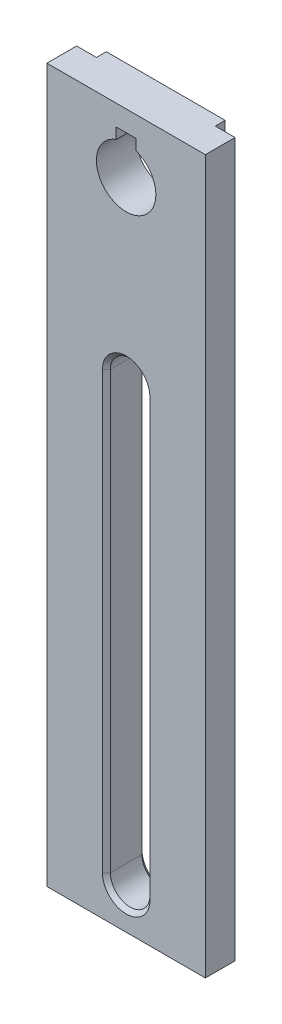
ISO-10303-21;
HEADER;
FILE_DESCRIPTION(('STEP AP214'),'2;1');
FILE_NAME('part.step','',(''),(''),'','','');
FILE_SCHEMA(('AUTOMOTIVE_DESIGN { 1 0 10303 214 1 1 1 1 }'));
ENDSEC;
DATA;
#1=APPLICATION_CONTEXT('core data for automotive mechanical design processes');
#2=APPLICATION_PROTOCOL_DEFINITION('international standard','automotive_design',2000,#1);
#3=PRODUCT_CONTEXT('',#1,'mechanical');
#4=PRODUCT('Part','Part','',(#3));
#5=PRODUCT_RELATED_PRODUCT_CATEGORY('part','',(#4));
#6=PRODUCT_DEFINITION_FORMATION('','',#4);
#7=PRODUCT_DEFINITION_CONTEXT('part definition',#1,'design');
#8=PRODUCT_DEFINITION('design','',#6,#7);
#9=PRODUCT_DEFINITION_SHAPE('','',#8);
#10=(LENGTH_UNIT() NAMED_UNIT(*) SI_UNIT(.MILLI.,.METRE.));
#11=(NAMED_UNIT(*) PLANE_ANGLE_UNIT() SI_UNIT($,.RADIAN.));
#12=(NAMED_UNIT(*) SI_UNIT($,.STERADIAN.) SOLID_ANGLE_UNIT());
#13=UNCERTAINTY_MEASURE_WITH_UNIT(LENGTH_MEASURE(1.E-05),#10,'distance_accuracy_value','');
#14=(GEOMETRIC_REPRESENTATION_CONTEXT(3) GLOBAL_UNCERTAINTY_ASSIGNED_CONTEXT((#13)) GLOBAL_UNIT_ASSIGNED_CONTEXT((#10,
#11,#12)) REPRESENTATION_CONTEXT('',''));
#15=CARTESIAN_POINT('',(0.,0.,0.));
#16=DIRECTION('',(0.,0.,1.));
#17=DIRECTION('',(1.,0.,0.));
#18=AXIS2_PLACEMENT_3D('',#15,#16,#17);
#19=CARTESIAN_POINT('',(0.,0.,10.));
#20=DIRECTION('',(0.,0.,1.));
#21=DIRECTION('',(1.,0.,0.));
#22=AXIS2_PLACEMENT_3D('',#19,#20,#21);
#23=PLANE('',#22);
#24=DIRECTION('',(0.,1.,0.));
#25=VECTOR('',#24,1.);
#26=CARTESIAN_POINT('',(-5.99999999999999,0.,9.99999999999995));
#27=LINE('',#26,#25);
#28=CARTESIAN_POINT('',(-6.00000000000001,30.,9.99999999999995));
#29=VERTEX_POINT('',#28);
#30=CARTESIAN_POINT('',(-5.99999999999999,140.,9.99999999999995));
#31=VERTEX_POINT('',#30);
#32=EDGE_CURVE('E234',#29,#31,#27,.T.);
#33=ORIENTED_EDGE('',*,*,#32,.T.);
#34=CARTESIAN_POINT('',(0.,140.,9.99999999999995));
#35=DIRECTION('',(0.,0.,1.));
#36=DIRECTION('',(1.,0.,0.));
#37=AXIS2_PLACEMENT_3D('',#34,#35,#36);
#38=CIRCLE('',#37,5.99999999999997);
#39=CARTESIAN_POINT('',(5.99999999999994,140.,9.99999999999995));
#40=VERTEX_POINT('',#39);
#41=EDGE_CURVE('E11',#31,#40,#38,.F.);
#42=ORIENTED_EDGE('',*,*,#41,.T.);
#43=DIRECTION('',(0.,-1.,0.));
#44=VECTOR('',#43,1.);
#45=CARTESIAN_POINT('',(6.00000000000001,0.,10.));
#46=LINE('',#45,#44);
#47=CARTESIAN_POINT('',(5.99999999999999,30.,9.99999999999995));
#48=VERTEX_POINT('',#47);
#49=EDGE_CURVE('E46',#40,#48,#46,.T.);
#50=ORIENTED_EDGE('',*,*,#49,.T.);
#51=CARTESIAN_POINT('',(0.,30.,9.99999999999995));
#52=DIRECTION('',(0.,0.,1.));
#53=DIRECTION('',(1.,0.,0.));
#54=AXIS2_PLACEMENT_3D('',#51,#52,#53);
#55=CIRCLE('',#54,6.);
#56=EDGE_CURVE('E236',#48,#29,#55,.F.);
#57=ORIENTED_EDGE('',*,*,#56,.T.);
#58=EDGE_LOOP('',(#33,#42,#50,#57));
#59=FACE_BOUND('',#58,.T.);
#60=DIRECTION('',(1.,0.,0.));
#61=VECTOR('',#60,1.);
#62=CARTESIAN_POINT('',(20.,20.,10.));
#63=LINE('',#62,#61);
#64=CARTESIAN_POINT('',(-19.9999999999999,20.,9.99999999999995));
#65=VERTEX_POINT('',#64);
#66=CARTESIAN_POINT('',(20.,20.,10.));
#67=VERTEX_POINT('',#66);
#68=EDGE_CURVE('E320',#65,#67,#63,.T.);
#69=ORIENTED_EDGE('',*,*,#68,.T.);
#70=DIRECTION('',(0.,1.,0.));
#71=VECTOR('',#70,1.);
#72=CARTESIAN_POINT('',(20.,200.,9.99999999999995));
#73=LINE('',#72,#71);
#74=CARTESIAN_POINT('',(20.,200.,9.99999999999995));
#75=VERTEX_POINT('',#74);
#76=EDGE_CURVE('E199',#67,#75,#73,.T.);
#77=ORIENTED_EDGE('',*,*,#76,.T.);
#78=DIRECTION('',(-1.,0.,0.));
#79=VECTOR('',#78,1.);
#80=CARTESIAN_POINT('',(20.,200.,9.99999999999995));
#81=LINE('',#80,#79);
#82=CARTESIAN_POINT('',(-20.,200.,9.99999999999995));
#83=VERTEX_POINT('',#82);
#84=EDGE_CURVE('E324',#75,#83,#81,.T.);
#85=ORIENTED_EDGE('',*,*,#84,.T.);
#86=DIRECTION('',(0.,-1.,0.));
#87=VECTOR('',#86,1.);
#88=CARTESIAN_POINT('',(-20.,200.,9.99999999999995));
#89=LINE('',#88,#87);
#90=EDGE_CURVE('E326',#83,#65,#89,.T.);
#91=ORIENTED_EDGE('',*,*,#90,.T.);
#92=EDGE_LOOP('',(#69,#77,#85,#91));
#93=FACE_BOUND('',#92,.T.);
#94=CARTESIAN_POINT('',(0.,185.,9.99999999999995));
#95=DIRECTION('',(0.,0.,1.));
#96=DIRECTION('',(1.,0.,0.));
#97=AXIS2_PLACEMENT_3D('',#94,#95,#96);
#98=CIRCLE('',#97,7.49999999999999);
#99=CARTESIAN_POINT('',(-2.49999999999996,192.071067811866,9.99999999999995));
#100=VERTEX_POINT('',#99);
#101=CARTESIAN_POINT('',(2.49999999999996,192.071067811865,9.99999999999995));
#102=VERTEX_POINT('',#101);
#103=EDGE_CURVE('E294',#100,#102,#98,.T.);
#104=ORIENTED_EDGE('',*,*,#103,.F.);
#105=DIRECTION('',(0.,-1.,0.));
#106=VECTOR('',#105,1.);
#107=CARTESIAN_POINT('',(-2.49999999999995,194.8,9.99999999999995));
#108=LINE('',#107,#106);
#109=CARTESIAN_POINT('',(-2.49999999999995,194.8,9.99999999999995));
#110=VERTEX_POINT('',#109);
#111=EDGE_CURVE('E292',#110,#100,#108,.T.);
#112=ORIENTED_EDGE('',*,*,#111,.F.);
#113=DIRECTION('',(-1.,0.,0.));
#114=VECTOR('',#113,1.);
#115=CARTESIAN_POINT('',(2.49999999999997,194.8,9.99999999999995));
#116=LINE('',#115,#114);
#117=CARTESIAN_POINT('',(2.49999999999997,194.8,9.99999999999995));
#118=VERTEX_POINT('',#117);
#119=EDGE_CURVE('E300',#118,#110,#116,.T.);
#120=ORIENTED_EDGE('',*,*,#119,.F.);
#121=DIRECTION('',(0.,1.,0.));
#122=VECTOR('',#121,1.);
#123=CARTESIAN_POINT('',(2.49999999999997,194.8,9.99999999999995));
#124=LINE('',#123,#122);
#125=EDGE_CURVE('E297',#102,#118,#124,.T.);
#126=ORIENTED_EDGE('',*,*,#125,.F.);
#127=EDGE_LOOP('',(#104,#112,#120,#126));
#128=FACE_BOUND('',#127,.T.);
#129=ADVANCED_FACE('F37',(#59,#93,#128),#23,.T.);
#130=CARTESIAN_POINT('',(0.,0.,0.));
#131=DIRECTION('',(0.,0.,1.));
#132=DIRECTION('',(1.,0.,0.));
#133=AXIS2_PLACEMENT_3D('',#130,#131,#132);
#134=PLANE('',#133);
#135=DIRECTION('',(0.,1.,0.));
#136=VECTOR('',#135,1.);
#137=CARTESIAN_POINT('',(5.99999999999995,140.,0.));
#138=LINE('',#137,#136);
#139=CARTESIAN_POINT('',(5.99999999999999,30.,0.));
#140=VERTEX_POINT('',#139);
#141=CARTESIAN_POINT('',(5.99999999999995,140.,0.));
#142=VERTEX_POINT('',#141);
#143=EDGE_CURVE('E204',#140,#142,#138,.T.);
#144=ORIENTED_EDGE('',*,*,#143,.T.);
#145=CARTESIAN_POINT('',(0.,140.,0.));
#146=DIRECTION('',(0.,0.,1.));
#147=DIRECTION('',(1.,0.,0.));
#148=AXIS2_PLACEMENT_3D('',#145,#146,#147);
#149=CIRCLE('',#148,5.99999999999998);
#150=CARTESIAN_POINT('',(-6.00000000000001,140.,0.));
#151=VERTEX_POINT('',#150);
#152=EDGE_CURVE('E213',#142,#151,#149,.T.);
#153=ORIENTED_EDGE('',*,*,#152,.T.);
#154=DIRECTION('',(0.,-1.,0.));
#155=VECTOR('',#154,1.);
#156=CARTESIAN_POINT('',(-6.00000000000002,30.,0.));
#157=LINE('',#156,#155);
#158=CARTESIAN_POINT('',(-6.00000000000002,30.,0.));
#159=VERTEX_POINT('',#158);
#160=EDGE_CURVE('E211',#151,#159,#157,.T.);
#161=ORIENTED_EDGE('',*,*,#160,.T.);
#162=CARTESIAN_POINT('',(0.,30.,0.));
#163=DIRECTION('',(0.,0.,1.));
#164=DIRECTION('',(1.,0.,0.));
#165=AXIS2_PLACEMENT_3D('',#162,#163,#164);
#166=CIRCLE('',#165,6.);
#167=EDGE_CURVE('E201',#159,#140,#166,.T.);
#168=ORIENTED_EDGE('',*,*,#167,.T.);
#169=EDGE_LOOP('',(#144,#153,#161,#168));
#170=FACE_BOUND('',#169,.T.);
#171=DIRECTION('',(0.,-1.,0.));
#172=VECTOR('',#171,1.);
#173=CARTESIAN_POINT('',(-2.49999999999995,194.8,0.));
#174=LINE('',#173,#172);
#175=CARTESIAN_POINT('',(-2.49999999999995,194.8,0.));
#176=VERTEX_POINT('',#175);
#177=CARTESIAN_POINT('',(-2.49999999999996,192.071067811866,0.));
#178=VERTEX_POINT('',#177);
#179=EDGE_CURVE('E282',#176,#178,#174,.T.);
#180=ORIENTED_EDGE('',*,*,#179,.T.);
#181=CARTESIAN_POINT('',(0.,185.,0.));
#182=DIRECTION('',(0.,0.,1.));
#183=DIRECTION('',(1.,0.,0.));
#184=AXIS2_PLACEMENT_3D('',#181,#182,#183);
#185=CIRCLE('',#184,7.49999999999999);
#186=CARTESIAN_POINT('',(2.49999999999996,192.071067811865,0.));
#187=VERTEX_POINT('',#186);
#188=EDGE_CURVE('E286',#178,#187,#185,.T.);
#189=ORIENTED_EDGE('',*,*,#188,.T.);
#190=DIRECTION('',(0.,1.,0.));
#191=VECTOR('',#190,1.);
#192=CARTESIAN_POINT('',(2.49999999999997,194.8,0.));
#193=LINE('',#192,#191);
#194=CARTESIAN_POINT('',(2.49999999999997,194.8,0.));
#195=VERTEX_POINT('',#194);
#196=EDGE_CURVE('E305',#187,#195,#193,.T.);
#197=ORIENTED_EDGE('',*,*,#196,.T.);
#198=DIRECTION('',(-1.,0.,0.));
#199=VECTOR('',#198,1.);
#200=CARTESIAN_POINT('',(2.49999999999997,194.8,0.));
#201=LINE('',#200,#199);
#202=EDGE_CURVE('E295',#195,#176,#201,.T.);
#203=ORIENTED_EDGE('',*,*,#202,.T.);
#204=EDGE_LOOP('',(#180,#189,#197,#203));
#205=FACE_BOUND('',#204,.T.);
#206=DIRECTION('',(-1.,0.,0.));
#207=VECTOR('',#206,1.);
#208=CARTESIAN_POINT('',(20.,200.,0.));
#209=LINE('',#208,#207);
#210=CARTESIAN_POINT('',(15.,200.,0.));
#211=VERTEX_POINT('',#210);
#212=CARTESIAN_POINT('',(-15.,200.,0.));
#213=VERTEX_POINT('',#212);
#214=EDGE_CURVE('E322',#211,#213,#209,.T.);
#215=ORIENTED_EDGE('',*,*,#214,.F.);
#216=DIRECTION('',(0.,1.,0.));
#217=VECTOR('',#216,1.);
#218=CARTESIAN_POINT('',(15.,20.,0.));
#219=LINE('',#218,#217);
#220=CARTESIAN_POINT('',(15.,20.,0.));
#221=VERTEX_POINT('',#220);
#222=EDGE_CURVE('E187',#221,#211,#219,.T.);
#223=ORIENTED_EDGE('',*,*,#222,.F.);
#224=DIRECTION('',(1.,0.,0.));
#225=VECTOR('',#224,1.);
#226=CARTESIAN_POINT('',(20.,20.,0.));
#227=LINE('',#226,#225);
#228=CARTESIAN_POINT('',(-15.,20.,0.));
#229=VERTEX_POINT('',#228);
#230=EDGE_CURVE('E319',#229,#221,#227,.T.);
#231=ORIENTED_EDGE('',*,*,#230,.F.);
#232=DIRECTION('',(0.,1.,0.));
#233=VECTOR('',#232,1.);
#234=CARTESIAN_POINT('',(-15.,20.,0.));
#235=LINE('',#234,#233);
#236=EDGE_CURVE('E359',#229,#213,#235,.T.);
#237=ORIENTED_EDGE('',*,*,#236,.T.);
#238=EDGE_LOOP('',(#215,#223,#231,#237));
#239=FACE_BOUND('',#238,.T.);
#240=ADVANCED_FACE('F383',(#170,#205,#239),#134,.F.);
#241=CARTESIAN_POINT('',(20.,20.,10.));
#242=DIRECTION('',(0.,1.,0.));
#243=DIRECTION('',(0.,0.,1.));
#244=AXIS2_PLACEMENT_3D('',#241,#242,#243);
#245=PLANE('',#244);
#246=DIRECTION('',(0.,0.,1.));
#247=VECTOR('',#246,1.);
#248=CARTESIAN_POINT('',(15.,20.,2.5));
#249=LINE('',#248,#247);
#250=CARTESIAN_POINT('',(15.,20.,2.5));
#251=VERTEX_POINT('',#250);
#252=EDGE_CURVE('E188',#221,#251,#249,.T.);
#253=ORIENTED_EDGE('',*,*,#252,.T.);
#254=DIRECTION('',(1.,0.,0.));
#255=VECTOR('',#254,1.);
#256=CARTESIAN_POINT('',(20.,20.,2.5));
#257=LINE('',#256,#255);
#258=CARTESIAN_POINT('',(20.,20.,2.5));
#259=VERTEX_POINT('',#258);
#260=EDGE_CURVE('E179',#251,#259,#257,.T.);
#261=ORIENTED_EDGE('',*,*,#260,.T.);
#262=DIRECTION('',(0.,0.,-1.));
#263=VECTOR('',#262,1.);
#264=CARTESIAN_POINT('',(20.,20.,10.));
#265=LINE('',#264,#263);
#266=EDGE_CURVE('E194',#67,#259,#265,.T.);
#267=ORIENTED_EDGE('',*,*,#266,.F.);
#268=ORIENTED_EDGE('',*,*,#68,.F.);
#269=DIRECTION('',(0.,0.,-1.));
#270=VECTOR('',#269,1.);
#271=CARTESIAN_POINT('',(-19.9999999999999,20.,9.99999999999995));
#272=LINE('',#271,#270);
#273=CARTESIAN_POINT('',(-19.9999999999999,20.,2.49999999999995));
#274=VERTEX_POINT('',#273);
#275=EDGE_CURVE('E328',#65,#274,#272,.T.);
#276=ORIENTED_EDGE('',*,*,#275,.T.);
#277=DIRECTION('',(1.,0.,0.));
#278=VECTOR('',#277,1.);
#279=CARTESIAN_POINT('',(-20.,20.,2.49999999999995));
#280=LINE('',#279,#278);
#281=CARTESIAN_POINT('',(-15.,20.,2.49999999999995));
#282=VERTEX_POINT('',#281);
#283=EDGE_CURVE('E352',#274,#282,#280,.T.);
#284=ORIENTED_EDGE('',*,*,#283,.T.);
#285=DIRECTION('',(0.,0.,-1.));
#286=VECTOR('',#285,1.);
#287=CARTESIAN_POINT('',(-15.,20.,2.49999999999995));
#288=LINE('',#287,#286);
#289=EDGE_CURVE('E356',#282,#229,#288,.T.);
#290=ORIENTED_EDGE('',*,*,#289,.T.);
#291=ORIENTED_EDGE('',*,*,#230,.T.);
#292=EDGE_LOOP('',(#253,#261,#267,#268,#276,#284,#290,#291));
#293=FACE_BOUND('',#292,.T.);
#294=ADVANCED_FACE('F192',(#293),#245,.F.);
#295=CARTESIAN_POINT('',(20.,200.,9.99999999999995));
#296=DIRECTION('',(-1.,0.,0.));
#297=DIRECTION('',(0.,-1.,0.));
#298=AXIS2_PLACEMENT_3D('',#295,#296,#297);
#299=PLANE('',#298);
#300=ORIENTED_EDGE('',*,*,#266,.T.);
#301=DIRECTION('',(0.,1.,0.));
#302=VECTOR('',#301,1.);
#303=CARTESIAN_POINT('',(20.,20.,2.5));
#304=LINE('',#303,#302);
#305=CARTESIAN_POINT('',(20.,200.,2.49999999999995));
#306=VERTEX_POINT('',#305);
#307=EDGE_CURVE('E176',#259,#306,#304,.T.);
#308=ORIENTED_EDGE('',*,*,#307,.T.);
#309=DIRECTION('',(0.,0.,-1.));
#310=VECTOR('',#309,1.);
#311=CARTESIAN_POINT('',(20.,200.,9.99999999999995));
#312=LINE('',#311,#310);
#313=EDGE_CURVE('E202',#75,#306,#312,.T.);
#314=ORIENTED_EDGE('',*,*,#313,.F.);
#315=ORIENTED_EDGE('',*,*,#76,.F.);
#316=EDGE_LOOP('',(#300,#308,#314,#315));
#317=FACE_BOUND('',#316,.T.);
#318=ADVANCED_FACE('F198',(#317),#299,.F.);
#319=CARTESIAN_POINT('',(20.,200.,9.99999999999995));
#320=DIRECTION('',(0.,-1.,0.));
#321=DIRECTION('',(0.,0.,-1.));
#322=AXIS2_PLACEMENT_3D('',#319,#320,#321);
#323=PLANE('',#322);
#324=ORIENTED_EDGE('',*,*,#313,.T.);
#325=DIRECTION('',(1.,0.,0.));
#326=VECTOR('',#325,1.);
#327=CARTESIAN_POINT('',(20.,200.,2.49999999999995));
#328=LINE('',#327,#326);
#329=CARTESIAN_POINT('',(15.,200.,2.49999999999995));
#330=VERTEX_POINT('',#329);
#331=EDGE_CURVE('E182',#330,#306,#328,.T.);
#332=ORIENTED_EDGE('',*,*,#331,.F.);
#333=DIRECTION('',(0.,0.,1.));
#334=VECTOR('',#333,1.);
#335=CARTESIAN_POINT('',(15.,200.,2.49999999999995));
#336=LINE('',#335,#334);
#337=EDGE_CURVE('E196',#211,#330,#336,.T.);
#338=ORIENTED_EDGE('',*,*,#337,.F.);
#339=ORIENTED_EDGE('',*,*,#214,.T.);
#340=DIRECTION('',(0.,0.,-1.));
#341=VECTOR('',#340,1.);
#342=CARTESIAN_POINT('',(-15.,200.,2.5));
#343=LINE('',#342,#341);
#344=CARTESIAN_POINT('',(-15.,200.,2.5));
#345=VERTEX_POINT('',#344);
#346=EDGE_CURVE('E348',#345,#213,#343,.T.);
#347=ORIENTED_EDGE('',*,*,#346,.F.);
#348=DIRECTION('',(1.,0.,0.));
#349=VECTOR('',#348,1.);
#350=CARTESIAN_POINT('',(-20.,200.,2.5));
#351=LINE('',#350,#349);
#352=CARTESIAN_POINT('',(-20.,200.,2.5));
#353=VERTEX_POINT('',#352);
#354=EDGE_CURVE('E346',#353,#345,#351,.T.);
#355=ORIENTED_EDGE('',*,*,#354,.F.);
#356=DIRECTION('',(0.,0.,-1.));
#357=VECTOR('',#356,1.);
#358=CARTESIAN_POINT('',(-20.,200.,9.99999999999995));
#359=LINE('',#358,#357);
#360=EDGE_CURVE('E206',#83,#353,#359,.T.);
#361=ORIENTED_EDGE('',*,*,#360,.F.);
#362=ORIENTED_EDGE('',*,*,#84,.F.);
#363=EDGE_LOOP('',(#324,#332,#338,#339,#347,#355,#361,#362));
#364=FACE_BOUND('',#363,.T.);
#365=ADVANCED_FACE('F343',(#364),#323,.F.);
#366=CARTESIAN_POINT('',(-20.,200.,9.99999999999995));
#367=DIRECTION('',(1.,0.,0.));
#368=DIRECTION('',(0.,1.,0.));
#369=AXIS2_PLACEMENT_3D('',#366,#367,#368);
#370=PLANE('',#369);
#371=ORIENTED_EDGE('',*,*,#360,.T.);
#372=DIRECTION('',(0.,1.,0.));
#373=VECTOR('',#372,1.);
#374=CARTESIAN_POINT('',(-20.,20.,2.49999999999995));
#375=LINE('',#374,#373);
#376=EDGE_CURVE('E339',#274,#353,#375,.T.);
#377=ORIENTED_EDGE('',*,*,#376,.F.);
#378=ORIENTED_EDGE('',*,*,#275,.F.);
#379=ORIENTED_EDGE('',*,*,#90,.F.);
#380=EDGE_LOOP('',(#371,#377,#378,#379));
#381=FACE_BOUND('',#380,.T.);
#382=ADVANCED_FACE('F337',(#381),#370,.F.);
#383=CARTESIAN_POINT('',(-2.49999999999995,194.8,9.99999999999995));
#384=DIRECTION('',(1.,0.,0.));
#385=DIRECTION('',(0.,1.,0.));
#386=AXIS2_PLACEMENT_3D('',#383,#384,#385);
#387=PLANE('',#386);
#388=ORIENTED_EDGE('',*,*,#179,.F.);
#389=DIRECTION('',(0.,0.,-1.));
#390=VECTOR('',#389,1.);
#391=CARTESIAN_POINT('',(-2.49999999999995,194.8,9.99999999999995));
#392=LINE('',#391,#390);
#393=EDGE_CURVE('E301',#110,#176,#392,.T.);
#394=ORIENTED_EDGE('',*,*,#393,.F.);
#395=ORIENTED_EDGE('',*,*,#111,.T.);
#396=DIRECTION('',(0.,0.,-1.));
#397=VECTOR('',#396,1.);
#398=CARTESIAN_POINT('',(-2.49999999999996,192.071067811866,9.99999999999995));
#399=LINE('',#398,#397);
#400=EDGE_CURVE('E316',#100,#178,#399,.T.);
#401=ORIENTED_EDGE('',*,*,#400,.T.);
#402=EDGE_LOOP('',(#388,#394,#395,#401));
#403=FACE_BOUND('',#402,.T.);
#404=ADVANCED_FACE('F411',(#403),#387,.T.);
#405=CARTESIAN_POINT('',(0.,185.,9.99999999999995));
#406=DIRECTION('',(0.,0.,-1.));
#407=DIRECTION('',(-1.,0.,0.));
#408=AXIS2_PLACEMENT_3D('',#405,#406,#407);
#409=CYLINDRICAL_SURFACE('',#408,7.49999999999999);
#410=ORIENTED_EDGE('',*,*,#188,.F.);
#411=ORIENTED_EDGE('',*,*,#400,.F.);
#412=ORIENTED_EDGE('',*,*,#103,.T.);
#413=DIRECTION('',(0.,0.,-1.));
#414=VECTOR('',#413,1.);
#415=CARTESIAN_POINT('',(2.49999999999996,192.071067811865,9.99999999999995));
#416=LINE('',#415,#414);
#417=EDGE_CURVE('E314',#102,#187,#416,.T.);
#418=ORIENTED_EDGE('',*,*,#417,.T.);
#419=EDGE_LOOP('',(#410,#411,#412,#418));
#420=FACE_BOUND('',#419,.T.);
#421=ADVANCED_FACE('F512',(#420),#409,.F.);
#422=CARTESIAN_POINT('',(2.49999999999997,194.8,9.99999999999995));
#423=DIRECTION('',(-1.,0.,0.));
#424=DIRECTION('',(0.,-1.,0.));
#425=AXIS2_PLACEMENT_3D('',#422,#423,#424);
#426=PLANE('',#425);
#427=ORIENTED_EDGE('',*,*,#196,.F.);
#428=ORIENTED_EDGE('',*,*,#417,.F.);
#429=ORIENTED_EDGE('',*,*,#125,.T.);
#430=DIRECTION('',(0.,0.,-1.));
#431=VECTOR('',#430,1.);
#432=CARTESIAN_POINT('',(2.49999999999997,194.8,9.99999999999995));
#433=LINE('',#432,#431);
#434=EDGE_CURVE('E312',#118,#195,#433,.T.);
#435=ORIENTED_EDGE('',*,*,#434,.T.);
#436=EDGE_LOOP('',(#427,#428,#429,#435));
#437=FACE_BOUND('',#436,.T.);
#438=ADVANCED_FACE('F504',(#437),#426,.T.);
#439=CARTESIAN_POINT('',(2.49999999999997,194.8,9.99999999999995));
#440=DIRECTION('',(0.,-1.,0.));
#441=DIRECTION('',(0.,0.,-1.));
#442=AXIS2_PLACEMENT_3D('',#439,#440,#441);
#443=PLANE('',#442);
#444=ORIENTED_EDGE('',*,*,#202,.F.);
#445=ORIENTED_EDGE('',*,*,#434,.F.);
#446=ORIENTED_EDGE('',*,*,#119,.T.);
#447=ORIENTED_EDGE('',*,*,#393,.T.);
#448=EDGE_LOOP('',(#444,#445,#446,#447));
#449=FACE_BOUND('',#448,.T.);
#450=ADVANCED_FACE('F497',(#449),#443,.T.);
#451=CARTESIAN_POINT('',(0.,140.,9.99999999999995));
#452=DIRECTION('',(0.,0.,-1.));
#453=DIRECTION('',(-1.,0.,0.));
#454=AXIS2_PLACEMENT_3D('',#451,#452,#453);
#455=CYLINDRICAL_SURFACE('',#454,5.);
#456=DIRECTION('',(0.,0.,-1.));
#457=VECTOR('',#456,1.);
#458=CARTESIAN_POINT('',(-5.00000000000002,140.,9.99999999999995));
#459=LINE('',#458,#457);
#460=CARTESIAN_POINT('',(-5.00000000000002,140.,9.00000000000001));
#461=VERTEX_POINT('',#460);
#462=CARTESIAN_POINT('',(-5.00000000000003,140.,1.));
#463=VERTEX_POINT('',#462);
#464=EDGE_CURVE('E276',#461,#463,#459,.T.);
#465=ORIENTED_EDGE('',*,*,#464,.T.);
#466=CARTESIAN_POINT('',(0.,140.,1.));
#467=DIRECTION('',(0.,0.,1.));
#468=DIRECTION('',(1.,0.,0.));
#469=AXIS2_PLACEMENT_3D('',#466,#467,#468);
#470=CIRCLE('',#469,5.);
#471=CARTESIAN_POINT('',(4.99999999999996,140.,1.));
#472=VERTEX_POINT('',#471);
#473=EDGE_CURVE('E219',#463,#472,#470,.F.);
#474=ORIENTED_EDGE('',*,*,#473,.T.);
#475=DIRECTION('',(0.,0.,-1.));
#476=VECTOR('',#475,1.);
#477=CARTESIAN_POINT('',(4.99999999999996,140.,9.99999999999995));
#478=LINE('',#477,#476);
#479=CARTESIAN_POINT('',(4.99999999999996,140.,9.00000000000001));
#480=VERTEX_POINT('',#479);
#481=EDGE_CURVE('E279',#480,#472,#478,.T.);
#482=ORIENTED_EDGE('',*,*,#481,.F.);
#483=CARTESIAN_POINT('',(0.,140.,9.00000000000001));
#484=DIRECTION('',(0.,0.,1.));
#485=DIRECTION('',(1.,0.,0.));
#486=AXIS2_PLACEMENT_3D('',#483,#484,#485);
#487=CIRCLE('',#486,5.);
#488=EDGE_CURVE('E216',#480,#461,#487,.T.);
#489=ORIENTED_EDGE('',*,*,#488,.T.);
#490=EDGE_LOOP('',(#465,#474,#482,#489));
#491=FACE_BOUND('',#490,.T.);
#492=ADVANCED_FACE('F275',(#491),#455,.F.);
#493=CARTESIAN_POINT('',(-5.00000000000002,140.,9.99999999999995));
#494=DIRECTION('',(1.,0.,0.));
#495=DIRECTION('',(0.,1.,0.));
#496=AXIS2_PLACEMENT_3D('',#493,#494,#495);
#497=PLANE('',#496);
#498=DIRECTION('',(0.,0.,-1.));
#499=VECTOR('',#498,1.);
#500=CARTESIAN_POINT('',(-5.00000000000003,30.,9.99999999999995));
#501=LINE('',#500,#499);
#502=CARTESIAN_POINT('',(-5.00000000000003,30.,8.99999999999995));
#503=VERTEX_POINT('',#502);
#504=CARTESIAN_POINT('',(-5.00000000000003,30.,0.999999999999945));
#505=VERTEX_POINT('',#504);
#506=EDGE_CURVE('E283',#503,#505,#501,.T.);
#507=ORIENTED_EDGE('',*,*,#506,.T.);
#508=DIRECTION('',(0.,1.,0.));
#509=VECTOR('',#508,1.);
#510=CARTESIAN_POINT('',(-5.00000000000003,140.,1.));
#511=LINE('',#510,#509);
#512=EDGE_CURVE('E224',#505,#463,#511,.T.);
#513=ORIENTED_EDGE('',*,*,#512,.T.);
#514=ORIENTED_EDGE('',*,*,#464,.F.);
#515=DIRECTION('',(0.,-1.,0.));
#516=VECTOR('',#515,1.);
#517=CARTESIAN_POINT('',(-5.00000000000002,140.,9.00000000000001));
#518=LINE('',#517,#516);
#519=EDGE_CURVE('E222',#461,#503,#518,.T.);
#520=ORIENTED_EDGE('',*,*,#519,.T.);
#521=EDGE_LOOP('',(#507,#513,#514,#520));
#522=FACE_BOUND('',#521,.T.);
#523=ADVANCED_FACE('F280',(#522),#497,.T.);
#524=CARTESIAN_POINT('',(0.,30.,9.99999999999995));
#525=DIRECTION('',(0.,0.,-1.));
#526=DIRECTION('',(-1.,0.,0.));
#527=AXIS2_PLACEMENT_3D('',#524,#525,#526);
#528=CYLINDRICAL_SURFACE('',#527,5.00000000000002);
#529=DIRECTION('',(0.,0.,-1.));
#530=VECTOR('',#529,1.);
#531=CARTESIAN_POINT('',(5.,30.,9.99999999999995));
#532=LINE('',#531,#530);
#533=CARTESIAN_POINT('',(5.,30.,8.99999999999995));
#534=VERTEX_POINT('',#533);
#535=CARTESIAN_POINT('',(5.,30.,0.999999999999945));
#536=VERTEX_POINT('',#535);
#537=EDGE_CURVE('E288',#534,#536,#532,.T.);
#538=ORIENTED_EDGE('',*,*,#537,.T.);
#539=CARTESIAN_POINT('',(0.,30.,0.999999999999945));
#540=DIRECTION('',(0.,0.,1.));
#541=DIRECTION('',(1.,0.,0.));
#542=AXIS2_PLACEMENT_3D('',#539,#540,#541);
#543=CIRCLE('',#542,5.00000000000002);
#544=EDGE_CURVE('E232',#536,#505,#543,.F.);
#545=ORIENTED_EDGE('',*,*,#544,.T.);
#546=ORIENTED_EDGE('',*,*,#506,.F.);
#547=CARTESIAN_POINT('',(0.,30.,8.99999999999995));
#548=DIRECTION('',(0.,0.,1.));
#549=DIRECTION('',(1.,0.,0.));
#550=AXIS2_PLACEMENT_3D('',#547,#548,#549);
#551=CIRCLE('',#550,5.00000000000002);
#552=EDGE_CURVE('E230',#503,#534,#551,.T.);
#553=ORIENTED_EDGE('',*,*,#552,.T.);
#554=EDGE_LOOP('',(#538,#545,#546,#553));
#555=FACE_BOUND('',#554,.T.);
#556=ADVANCED_FACE('F369',(#555),#528,.F.);
#557=CARTESIAN_POINT('',(4.99999999999996,140.,9.99999999999995));
#558=DIRECTION('',(-1.,0.,0.));
#559=DIRECTION('',(0.,-1.,0.));
#560=AXIS2_PLACEMENT_3D('',#557,#558,#559);
#561=PLANE('',#560);
#562=ORIENTED_EDGE('',*,*,#481,.T.);
#563=DIRECTION('',(0.,-1.,0.));
#564=VECTOR('',#563,1.);
#565=CARTESIAN_POINT('',(5.,30.,0.999999999999945));
#566=LINE('',#565,#564);
#567=EDGE_CURVE('E228',#472,#536,#566,.T.);
#568=ORIENTED_EDGE('',*,*,#567,.T.);
#569=ORIENTED_EDGE('',*,*,#537,.F.);
#570=DIRECTION('',(0.,1.,0.));
#571=VECTOR('',#570,1.);
#572=CARTESIAN_POINT('',(4.99999999999996,140.,9.00000000000001));
#573=LINE('',#572,#571);
#574=EDGE_CURVE('E226',#534,#480,#573,.T.);
#575=ORIENTED_EDGE('',*,*,#574,.T.);
#576=EDGE_LOOP('',(#562,#568,#569,#575));
#577=FACE_BOUND('',#576,.T.);
#578=ADVANCED_FACE('F391',(#577),#561,.T.);
#579=CARTESIAN_POINT('',(-15.,20.,2.49999999999995));
#580=DIRECTION('',(1.,0.,0.));
#581=DIRECTION('',(0.,0.,-1.));
#582=AXIS2_PLACEMENT_3D('',#579,#580,#581);
#583=PLANE('',#582);
#584=ORIENTED_EDGE('',*,*,#346,.T.);
#585=ORIENTED_EDGE('',*,*,#236,.F.);
#586=ORIENTED_EDGE('',*,*,#289,.F.);
#587=DIRECTION('',(0.,1.,0.));
#588=VECTOR('',#587,1.);
#589=CARTESIAN_POINT('',(-15.,20.,2.49999999999995));
#590=LINE('',#589,#588);
#591=EDGE_CURVE('E362',#282,#345,#590,.T.);
#592=ORIENTED_EDGE('',*,*,#591,.T.);
#593=EDGE_LOOP('',(#584,#585,#586,#592));
#594=FACE_BOUND('',#593,.T.);
#595=ADVANCED_FACE('F393',(#594),#583,.F.);
#596=CARTESIAN_POINT('',(-20.,20.,2.49999999999995));
#597=DIRECTION('',(0.,0.,1.));
#598=DIRECTION('',(1.,0.,0.));
#599=AXIS2_PLACEMENT_3D('',#596,#597,#598);
#600=PLANE('',#599);
#601=ORIENTED_EDGE('',*,*,#354,.T.);
#602=ORIENTED_EDGE('',*,*,#591,.F.);
#603=ORIENTED_EDGE('',*,*,#283,.F.);
#604=ORIENTED_EDGE('',*,*,#376,.T.);
#605=EDGE_LOOP('',(#601,#602,#603,#604));
#606=FACE_BOUND('',#605,.T.);
#607=ADVANCED_FACE('F399',(#606),#600,.F.);
#608=CARTESIAN_POINT('',(20.,20.,2.5));
#609=DIRECTION('',(0.,0.,1.));
#610=DIRECTION('',(1.,0.,0.));
#611=AXIS2_PLACEMENT_3D('',#608,#609,#610);
#612=PLANE('',#611);
#613=ORIENTED_EDGE('',*,*,#331,.T.);
#614=ORIENTED_EDGE('',*,*,#307,.F.);
#615=ORIENTED_EDGE('',*,*,#260,.F.);
#616=DIRECTION('',(0.,1.,0.));
#617=VECTOR('',#616,1.);
#618=CARTESIAN_POINT('',(15.,20.,2.5));
#619=LINE('',#618,#617);
#620=EDGE_CURVE('E350',#251,#330,#619,.T.);
#621=ORIENTED_EDGE('',*,*,#620,.T.);
#622=EDGE_LOOP('',(#613,#614,#615,#621));
#623=FACE_BOUND('',#622,.T.);
#624=ADVANCED_FACE('F178',(#623),#612,.F.);
#625=CARTESIAN_POINT('',(15.,20.,2.5));
#626=DIRECTION('',(-1.,0.,0.));
#627=DIRECTION('',(0.,0.,1.));
#628=AXIS2_PLACEMENT_3D('',#625,#626,#627);
#629=PLANE('',#628);
#630=ORIENTED_EDGE('',*,*,#337,.T.);
#631=ORIENTED_EDGE('',*,*,#620,.F.);
#632=ORIENTED_EDGE('',*,*,#252,.F.);
#633=ORIENTED_EDGE('',*,*,#222,.T.);
#634=EDGE_LOOP('',(#630,#631,#632,#633));
#635=FACE_BOUND('',#634,.T.);
#636=ADVANCED_FACE('F430',(#635),#629,.F.);
#637=CARTESIAN_POINT('',(0.,30.,0.));
#638=DIRECTION('',(0.,0.,-1.));
#639=DIRECTION('',(-1.,0.,0.));
#640=AXIS2_PLACEMENT_3D('',#637,#638,#639);
#641=CONICAL_SURFACE('',#640,6.,0.785398163397428);
#642=DIRECTION('',(-0.707106781186533,0.,-0.707106781186561));
#643=VECTOR('',#642,1.);
#644=CARTESIAN_POINT('',(-5.00000000000003,30.,0.999999999999945));
#645=LINE('',#644,#643);
#646=EDGE_CURVE('E243',#505,#159,#645,.T.);
#647=ORIENTED_EDGE('',*,*,#646,.F.);
#648=ORIENTED_EDGE('',*,*,#544,.F.);
#649=DIRECTION('',(-0.707106781186533,0.,0.707106781186561));
#650=VECTOR('',#649,1.);
#651=CARTESIAN_POINT('',(5.99999999999999,30.,0.));
#652=LINE('',#651,#650);
#653=EDGE_CURVE('E246',#140,#536,#652,.T.);
#654=ORIENTED_EDGE('',*,*,#653,.F.);
#655=ORIENTED_EDGE('',*,*,#167,.F.);
#656=EDGE_LOOP('',(#647,#648,#654,#655));
#657=FACE_BOUND('',#656,.T.);
#658=ADVANCED_FACE('F374',(#657),#641,.F.);
#659=CARTESIAN_POINT('',(6.00000000000001,0.,0.));
#660=DIRECTION('',(-0.707106781186562,0.,-0.707106781186533));
#661=DIRECTION('',(0.,-1.,0.));
#662=AXIS2_PLACEMENT_3D('',#659,#660,#661);
#663=PLANE('',#662);
#664=ORIENTED_EDGE('',*,*,#653,.T.);
#665=ORIENTED_EDGE('',*,*,#567,.F.);
#666=DIRECTION('',(-0.707106781186533,0.,0.707106781186561));
#667=VECTOR('',#666,1.);
#668=CARTESIAN_POINT('',(5.99999999999995,140.,0.));
#669=LINE('',#668,#667);
#670=EDGE_CURVE('E241',#142,#472,#669,.T.);
#671=ORIENTED_EDGE('',*,*,#670,.F.);
#672=ORIENTED_EDGE('',*,*,#143,.F.);
#673=EDGE_LOOP('',(#664,#665,#671,#672));
#674=FACE_BOUND('',#673,.T.);
#675=ADVANCED_FACE('F379',(#674),#663,.T.);
#676=CARTESIAN_POINT('',(-6.00000000000001,0.,0.));
#677=DIRECTION('',(0.707106781186561,0.,-0.707106781186533));
#678=DIRECTION('',(0.,1.,0.));
#679=AXIS2_PLACEMENT_3D('',#676,#677,#678);
#680=PLANE('',#679);
#681=ORIENTED_EDGE('',*,*,#646,.T.);
#682=ORIENTED_EDGE('',*,*,#160,.F.);
#683=DIRECTION('',(-0.707106781186533,0.,-0.707106781186561));
#684=VECTOR('',#683,1.);
#685=CARTESIAN_POINT('',(-5.00000000000003,140.,1.));
#686=LINE('',#685,#684);
#687=EDGE_CURVE('E239',#463,#151,#686,.T.);
#688=ORIENTED_EDGE('',*,*,#687,.F.);
#689=ORIENTED_EDGE('',*,*,#512,.F.);
#690=EDGE_LOOP('',(#681,#682,#688,#689));
#691=FACE_BOUND('',#690,.T.);
#692=ADVANCED_FACE('F387',(#691),#680,.T.);
#693=CARTESIAN_POINT('',(0.,140.,0.));
#694=DIRECTION('',(0.,0.,-1.));
#695=DIRECTION('',(-1.,0.,0.));
#696=AXIS2_PLACEMENT_3D('',#693,#694,#695);
#697=CONICAL_SURFACE('',#696,5.99999999999998,0.785398163397428);
#698=ORIENTED_EDGE('',*,*,#670,.T.);
#699=ORIENTED_EDGE('',*,*,#473,.F.);
#700=ORIENTED_EDGE('',*,*,#687,.T.);
#701=ORIENTED_EDGE('',*,*,#152,.F.);
#702=EDGE_LOOP('',(#698,#699,#700,#701));
#703=FACE_BOUND('',#702,.T.);
#704=ADVANCED_FACE('F390',(#703),#697,.F.);
#705=CARTESIAN_POINT('',(0.,30.,8.99999999999995));
#706=DIRECTION('',(0.,0.,1.));
#707=DIRECTION('',(1.,0.,0.));
#708=AXIS2_PLACEMENT_3D('',#705,#706,#707);
#709=CONICAL_SURFACE('',#708,5.00000000000002,0.785398163397448);
#710=DIRECTION('',(0.707106781186547,0.,-0.707106781186547));
#711=VECTOR('',#710,1.);
#712=CARTESIAN_POINT('',(-6.00000000000001,30.,9.99999999999995));
#713=LINE('',#712,#711);
#714=EDGE_CURVE('E251',#29,#503,#713,.T.);
#715=ORIENTED_EDGE('',*,*,#714,.F.);
#716=ORIENTED_EDGE('',*,*,#56,.F.);
#717=DIRECTION('',(0.707106781186548,0.,0.707106781186547));
#718=VECTOR('',#717,1.);
#719=CARTESIAN_POINT('',(5.,30.,8.99999999999995));
#720=LINE('',#719,#718);
#721=EDGE_CURVE('E41',#534,#48,#720,.T.);
#722=ORIENTED_EDGE('',*,*,#721,.F.);
#723=ORIENTED_EDGE('',*,*,#552,.F.);
#724=EDGE_LOOP('',(#715,#716,#722,#723));
#725=FACE_BOUND('',#724,.T.);
#726=ADVANCED_FACE('F39',(#725),#709,.F.);
#727=CARTESIAN_POINT('',(4.99999999999996,140.,9.00000000000001));
#728=DIRECTION('',(0.707106781186547,0.,-0.707106781186547));
#729=DIRECTION('',(0.,1.,0.));
#730=AXIS2_PLACEMENT_3D('',#727,#728,#729);
#731=PLANE('',#730);
#732=ORIENTED_EDGE('',*,*,#721,.T.);
#733=ORIENTED_EDGE('',*,*,#49,.F.);
#734=DIRECTION('',(0.707106781186548,0.,0.707106781186547));
#735=VECTOR('',#734,1.);
#736=CARTESIAN_POINT('',(4.99999999999996,140.,9.00000000000001));
#737=LINE('',#736,#735);
#738=EDGE_CURVE('E54',#480,#40,#737,.T.);
#739=ORIENTED_EDGE('',*,*,#738,.F.);
#740=ORIENTED_EDGE('',*,*,#574,.F.);
#741=EDGE_LOOP('',(#732,#733,#739,#740));
#742=FACE_BOUND('',#741,.T.);
#743=ADVANCED_FACE('F261',(#742),#731,.F.);
#744=CARTESIAN_POINT('',(-5.00000000000002,140.,9.00000000000001));
#745=DIRECTION('',(-0.707106781186548,0.,-0.707106781186547));
#746=DIRECTION('',(0.,-1.,0.));
#747=AXIS2_PLACEMENT_3D('',#744,#745,#746);
#748=PLANE('',#747);
#749=ORIENTED_EDGE('',*,*,#714,.T.);
#750=ORIENTED_EDGE('',*,*,#519,.F.);
#751=DIRECTION('',(0.707106781186547,0.,-0.707106781186547));
#752=VECTOR('',#751,1.);
#753=CARTESIAN_POINT('',(-5.99999999999999,140.,9.99999999999995));
#754=LINE('',#753,#752);
#755=EDGE_CURVE('E249',#31,#461,#754,.T.);
#756=ORIENTED_EDGE('',*,*,#755,.F.);
#757=ORIENTED_EDGE('',*,*,#32,.F.);
#758=EDGE_LOOP('',(#749,#750,#756,#757));
#759=FACE_BOUND('',#758,.T.);
#760=ADVANCED_FACE('F267',(#759),#748,.F.);
#761=CARTESIAN_POINT('',(0.,140.,9.00000000000001));
#762=DIRECTION('',(0.,0.,1.));
#763=DIRECTION('',(1.,0.,0.));
#764=AXIS2_PLACEMENT_3D('',#761,#762,#763);
#765=CONICAL_SURFACE('',#764,5.,0.785398163397448);
#766=ORIENTED_EDGE('',*,*,#738,.T.);
#767=ORIENTED_EDGE('',*,*,#41,.F.);
#768=ORIENTED_EDGE('',*,*,#755,.T.);
#769=ORIENTED_EDGE('',*,*,#488,.F.);
#770=EDGE_LOOP('',(#766,#767,#768,#769));
#771=FACE_BOUND('',#770,.T.);
#772=ADVANCED_FACE('F266',(#771),#765,.F.);
#773=CLOSED_SHELL('',(#129,#240,#294,#318,#365,#382,#404,#421,#438,#450,#492,#523,#556,#578,
#595,#607,#624,#636,#658,#675,#692,#704,#726,#743,#760,#772));
#774=MANIFOLD_SOLID_BREP('B2',#773);
#775=ADVANCED_BREP_SHAPE_REPRESENTATION('',(#18,#774),#14);
#776=SHAPE_DEFINITION_REPRESENTATION(#9,#775);
ENDSEC;
END-ISO-10303-21;
